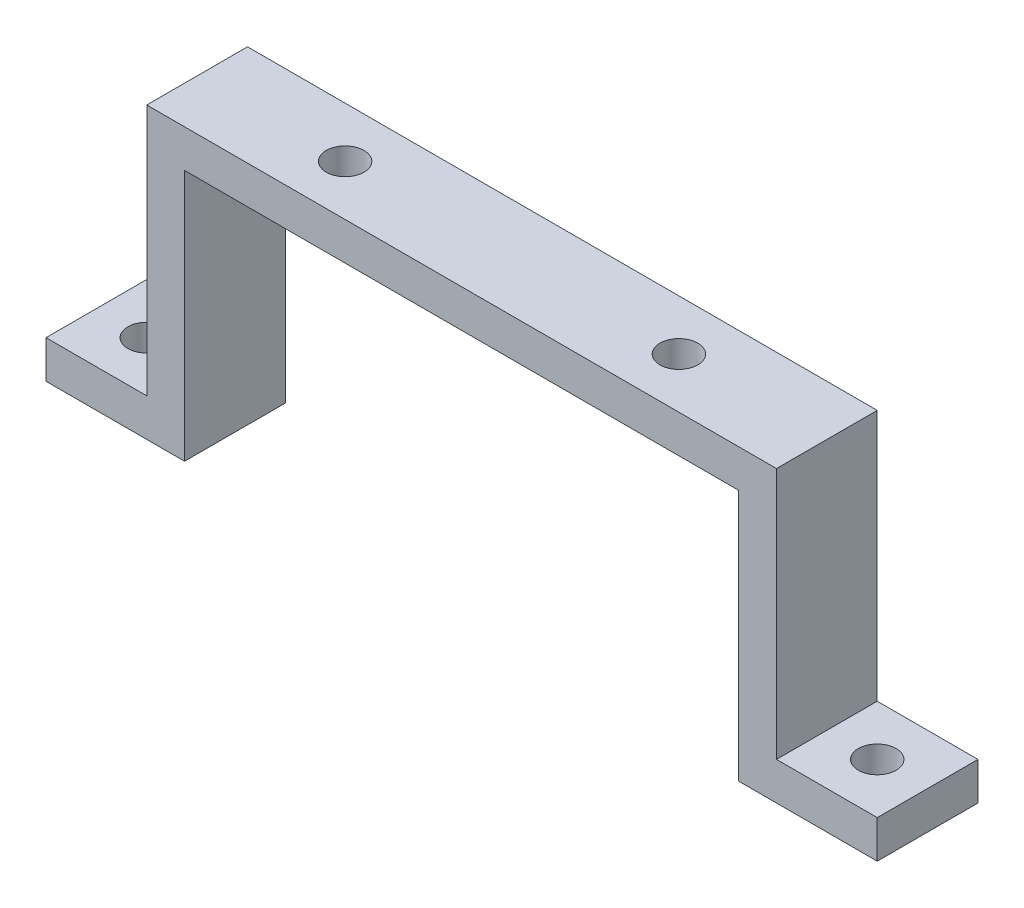
ISO-10303-21;
HEADER;
FILE_DESCRIPTION(('STEP AP214'),'2;1');
FILE_NAME('part.step','',(''),(''),'','','');
FILE_SCHEMA(('AUTOMOTIVE_DESIGN { 1 0 10303 214 1 1 1 1 }'));
ENDSEC;
DATA;
#1=APPLICATION_CONTEXT('core data for automotive mechanical design processes');
#2=APPLICATION_PROTOCOL_DEFINITION('international standard','automotive_design',2000,#1);
#3=PRODUCT_CONTEXT('',#1,'mechanical');
#4=PRODUCT('Part','Part','',(#3));
#5=PRODUCT_RELATED_PRODUCT_CATEGORY('part','',(#4));
#6=PRODUCT_DEFINITION_FORMATION('','',#4);
#7=PRODUCT_DEFINITION_CONTEXT('part definition',#1,'design');
#8=PRODUCT_DEFINITION('design','',#6,#7);
#9=PRODUCT_DEFINITION_SHAPE('','',#8);
#10=(LENGTH_UNIT() NAMED_UNIT(*) SI_UNIT(.MILLI.,.METRE.));
#11=(NAMED_UNIT(*) PLANE_ANGLE_UNIT() SI_UNIT($,.RADIAN.));
#12=(NAMED_UNIT(*) SI_UNIT($,.STERADIAN.) SOLID_ANGLE_UNIT());
#13=UNCERTAINTY_MEASURE_WITH_UNIT(LENGTH_MEASURE(1.E-05),#10,'distance_accuracy_value','');
#14=(GEOMETRIC_REPRESENTATION_CONTEXT(3) GLOBAL_UNCERTAINTY_ASSIGNED_CONTEXT((#13)) GLOBAL_UNIT_ASSIGNED_CONTEXT((#10,
#11,#12)) REPRESENTATION_CONTEXT('',''));
#15=CARTESIAN_POINT('',(0.,0.,0.));
#16=DIRECTION('',(0.,0.,1.));
#17=DIRECTION('',(1.,0.,0.));
#18=AXIS2_PLACEMENT_3D('',#15,#16,#17);
#19=CARTESIAN_POINT('',(25.,3.,4.));
#20=DIRECTION('',(-1.,0.,0.));
#21=DIRECTION('',(0.,0.,1.));
#22=AXIS2_PLACEMENT_3D('',#19,#20,#21);
#23=PLANE('',#22);
#24=DIRECTION('',(0.,0.,1.));
#25=VECTOR('',#24,1.);
#26=CARTESIAN_POINT('',(25.,-17.,-4.));
#27=LINE('',#26,#25);
#28=CARTESIAN_POINT('',(25.,-17.,-4.));
#29=VERTEX_POINT('',#28);
#30=CARTESIAN_POINT('',(25.,-17.,4.));
#31=VERTEX_POINT('',#30);
#32=EDGE_CURVE('E58',#29,#31,#27,.T.);
#33=ORIENTED_EDGE('',*,*,#32,.F.);
#34=DIRECTION('',(0.,-1.,0.));
#35=VECTOR('',#34,1.);
#36=CARTESIAN_POINT('',(25.,3.,-4.));
#37=LINE('',#36,#35);
#38=CARTESIAN_POINT('',(25.,3.,-4.));
#39=VERTEX_POINT('',#38);
#40=EDGE_CURVE('E11',#39,#29,#37,.T.);
#41=ORIENTED_EDGE('',*,*,#40,.F.);
#42=DIRECTION('',(0.,0.,-1.));
#43=VECTOR('',#42,1.);
#44=CARTESIAN_POINT('',(25.,3.,4.));
#45=LINE('',#44,#43);
#46=CARTESIAN_POINT('',(25.,3.,4.));
#47=VERTEX_POINT('',#46);
#48=EDGE_CURVE('E262',#47,#39,#45,.T.);
#49=ORIENTED_EDGE('',*,*,#48,.F.);
#50=DIRECTION('',(0.,-1.,0.));
#51=VECTOR('',#50,1.);
#52=CARTESIAN_POINT('',(25.,3.,4.));
#53=LINE('',#52,#51);
#54=EDGE_CURVE('E276',#47,#31,#53,.T.);
#55=ORIENTED_EDGE('',*,*,#54,.T.);
#56=EDGE_LOOP('',(#33,#41,#49,#55));
#57=FACE_BOUND('',#56,.T.);
#58=ADVANCED_FACE('F43',(#57),#23,.F.);
#59=CARTESIAN_POINT('',(0.,3.,0.));
#60=DIRECTION('',(0.,-1.,0.));
#61=DIRECTION('',(0.,0.,-1.));
#62=AXIS2_PLACEMENT_3D('',#59,#60,#61);
#63=PLANE('',#62);
#64=ORIENTED_EDGE('',*,*,#48,.T.);
#65=DIRECTION('',(-1.,0.,0.));
#66=VECTOR('',#65,1.);
#67=CARTESIAN_POINT('',(-25.,3.,-4.));
#68=LINE('',#67,#66);
#69=CARTESIAN_POINT('',(-25.,3.,-4.));
#70=VERTEX_POINT('',#69);
#71=EDGE_CURVE('E266',#39,#70,#68,.T.);
#72=ORIENTED_EDGE('',*,*,#71,.T.);
#73=DIRECTION('',(0.,0.,1.));
#74=VECTOR('',#73,1.);
#75=CARTESIAN_POINT('',(-25.,3.,4.));
#76=LINE('',#75,#74);
#77=CARTESIAN_POINT('',(-25.,3.,4.));
#78=VERTEX_POINT('',#77);
#79=EDGE_CURVE('E270',#70,#78,#76,.T.);
#80=ORIENTED_EDGE('',*,*,#79,.T.);
#81=DIRECTION('',(1.,0.,0.));
#82=VECTOR('',#81,1.);
#83=CARTESIAN_POINT('',(-25.,3.,4.));
#84=LINE('',#83,#82);
#85=EDGE_CURVE('E273',#78,#47,#84,.T.);
#86=ORIENTED_EDGE('',*,*,#85,.T.);
#87=EDGE_LOOP('',(#64,#72,#80,#86));
#88=FACE_BOUND('',#87,.T.);
#89=CARTESIAN_POINT('',(-13.25,3.,0.));
#90=DIRECTION('',(0.,1.,0.));
#91=DIRECTION('',(0.,0.,1.));
#92=AXIS2_PLACEMENT_3D('',#89,#90,#91);
#93=CIRCLE('',#92,1.5);
#94=CARTESIAN_POINT('',(-13.25,3.,1.5));
#95=VERTEX_POINT('',#94);
#96=EDGE_CURVE('E254',#95,#95,#93,.T.);
#97=ORIENTED_EDGE('',*,*,#96,.F.);
#98=EDGE_LOOP('',(#97));
#99=FACE_BOUND('',#98,.T.);
#100=CARTESIAN_POINT('',(13.25,3.,0.));
#101=DIRECTION('',(0.,1.,0.));
#102=DIRECTION('',(0.,0.,1.));
#103=AXIS2_PLACEMENT_3D('',#100,#101,#102);
#104=CIRCLE('',#103,1.5);
#105=CARTESIAN_POINT('',(13.25,3.,1.5));
#106=VERTEX_POINT('',#105);
#107=EDGE_CURVE('E246',#106,#106,#104,.T.);
#108=ORIENTED_EDGE('',*,*,#107,.F.);
#109=EDGE_LOOP('',(#108));
#110=FACE_BOUND('',#109,.T.);
#111=ADVANCED_FACE('F305',(#88,#99,#110),#63,.F.);
#112=CARTESIAN_POINT('',(0.,0.,0.));
#113=DIRECTION('',(0.,-1.,0.));
#114=DIRECTION('',(0.,0.,-1.));
#115=AXIS2_PLACEMENT_3D('',#112,#113,#114);
#116=PLANE('',#115);
#117=DIRECTION('',(0.,0.,1.));
#118=VECTOR('',#117,1.);
#119=CARTESIAN_POINT('',(22.,0.,-4.));
#120=LINE('',#119,#118);
#121=CARTESIAN_POINT('',(22.,0.,-4.));
#122=VERTEX_POINT('',#121);
#123=CARTESIAN_POINT('',(22.,0.,4.));
#124=VERTEX_POINT('',#123);
#125=EDGE_CURVE('E170',#122,#124,#120,.T.);
#126=ORIENTED_EDGE('',*,*,#125,.T.);
#127=DIRECTION('',(1.,0.,0.));
#128=VECTOR('',#127,1.);
#129=CARTESIAN_POINT('',(-25.,0.,4.));
#130=LINE('',#129,#128);
#131=CARTESIAN_POINT('',(-22.,0.,4.));
#132=VERTEX_POINT('',#131);
#133=EDGE_CURVE('E267',#132,#124,#130,.T.);
#134=ORIENTED_EDGE('',*,*,#133,.F.);
#135=DIRECTION('',(0.,0.,1.));
#136=VECTOR('',#135,1.);
#137=CARTESIAN_POINT('',(-22.,0.,-4.));
#138=LINE('',#137,#136);
#139=CARTESIAN_POINT('',(-22.,0.,-4.));
#140=VERTEX_POINT('',#139);
#141=EDGE_CURVE('E221',#140,#132,#138,.T.);
#142=ORIENTED_EDGE('',*,*,#141,.F.);
#143=DIRECTION('',(-1.,0.,0.));
#144=VECTOR('',#143,1.);
#145=CARTESIAN_POINT('',(-25.,0.,-4.));
#146=LINE('',#145,#144);
#147=EDGE_CURVE('E258',#122,#140,#146,.T.);
#148=ORIENTED_EDGE('',*,*,#147,.F.);
#149=EDGE_LOOP('',(#126,#134,#142,#148));
#150=FACE_BOUND('',#149,.T.);
#151=CARTESIAN_POINT('',(-13.25,0.,0.));
#152=DIRECTION('',(0.,1.,0.));
#153=DIRECTION('',(0.,0.,1.));
#154=AXIS2_PLACEMENT_3D('',#151,#152,#153);
#155=CIRCLE('',#154,1.5);
#156=CARTESIAN_POINT('',(-13.25,0.,1.5));
#157=VERTEX_POINT('',#156);
#158=EDGE_CURVE('E250',#157,#157,#155,.T.);
#159=ORIENTED_EDGE('',*,*,#158,.T.);
#160=EDGE_LOOP('',(#159));
#161=FACE_BOUND('',#160,.T.);
#162=CARTESIAN_POINT('',(13.25,0.,0.));
#163=DIRECTION('',(0.,1.,0.));
#164=DIRECTION('',(0.,0.,1.));
#165=AXIS2_PLACEMENT_3D('',#162,#163,#164);
#166=CIRCLE('',#165,1.5);
#167=CARTESIAN_POINT('',(13.25,0.,1.5));
#168=VERTEX_POINT('',#167);
#169=EDGE_CURVE('E245',#168,#168,#166,.T.);
#170=ORIENTED_EDGE('',*,*,#169,.T.);
#171=EDGE_LOOP('',(#170));
#172=FACE_BOUND('',#171,.T.);
#173=ADVANCED_FACE('F311',(#150,#161,#172),#116,.T.);
#174=CARTESIAN_POINT('',(-25.,3.,-4.));
#175=DIRECTION('',(0.,0.,1.));
#176=DIRECTION('',(1.,0.,0.));
#177=AXIS2_PLACEMENT_3D('',#174,#175,#176);
#178=PLANE('',#177);
#179=ORIENTED_EDGE('',*,*,#40,.T.);
#180=DIRECTION('',(-1.,0.,0.));
#181=VECTOR('',#180,1.);
#182=CARTESIAN_POINT('',(25.,-17.,-4.));
#183=LINE('',#182,#181);
#184=CARTESIAN_POINT('',(33.,-17.,-4.));
#185=VERTEX_POINT('',#184);
#186=EDGE_CURVE('E138',#185,#29,#183,.T.);
#187=ORIENTED_EDGE('',*,*,#186,.F.);
#188=DIRECTION('',(0.,-1.,0.));
#189=VECTOR('',#188,1.);
#190=CARTESIAN_POINT('',(33.,-17.,-4.));
#191=LINE('',#190,#189);
#192=CARTESIAN_POINT('',(33.,-20.,-4.));
#193=VERTEX_POINT('',#192);
#194=EDGE_CURVE('E148',#185,#193,#191,.T.);
#195=ORIENTED_EDGE('',*,*,#194,.T.);
#196=DIRECTION('',(-1.,0.,0.));
#197=VECTOR('',#196,1.);
#198=CARTESIAN_POINT('',(25.,-20.,-4.));
#199=LINE('',#198,#197);
#200=CARTESIAN_POINT('',(22.,-20.,-4.));
#201=VERTEX_POINT('',#200);
#202=EDGE_CURVE('E179',#193,#201,#199,.T.);
#203=ORIENTED_EDGE('',*,*,#202,.T.);
#204=DIRECTION('',(0.,1.,0.));
#205=VECTOR('',#204,1.);
#206=CARTESIAN_POINT('',(22.,-20.,-4.));
#207=LINE('',#206,#205);
#208=EDGE_CURVE('E182',#201,#122,#207,.T.);
#209=ORIENTED_EDGE('',*,*,#208,.T.);
#210=ORIENTED_EDGE('',*,*,#147,.T.);
#211=DIRECTION('',(0.,1.,0.));
#212=VECTOR('',#211,1.);
#213=CARTESIAN_POINT('',(-22.,-20.,-4.));
#214=LINE('',#213,#212);
#215=CARTESIAN_POINT('',(-22.,-20.,-4.));
#216=VERTEX_POINT('',#215);
#217=EDGE_CURVE('E241',#216,#140,#214,.T.);
#218=ORIENTED_EDGE('',*,*,#217,.F.);
#219=DIRECTION('',(1.,0.,0.));
#220=VECTOR('',#219,1.);
#221=CARTESIAN_POINT('',(-25.,-20.,-4.));
#222=LINE('',#221,#220);
#223=CARTESIAN_POINT('',(-33.,-20.,-4.));
#224=VERTEX_POINT('',#223);
#225=EDGE_CURVE('E225',#224,#216,#222,.T.);
#226=ORIENTED_EDGE('',*,*,#225,.F.);
#227=DIRECTION('',(0.,-1.,0.));
#228=VECTOR('',#227,1.);
#229=CARTESIAN_POINT('',(-33.,-17.,-4.));
#230=LINE('',#229,#228);
#231=CARTESIAN_POINT('',(-33.,-17.,-4.));
#232=VERTEX_POINT('',#231);
#233=EDGE_CURVE('E217',#232,#224,#230,.T.);
#234=ORIENTED_EDGE('',*,*,#233,.F.);
#235=DIRECTION('',(1.,0.,0.));
#236=VECTOR('',#235,1.);
#237=CARTESIAN_POINT('',(-25.,-17.,-4.));
#238=LINE('',#237,#236);
#239=CARTESIAN_POINT('',(-25.,-17.,-4.));
#240=VERTEX_POINT('',#239);
#241=EDGE_CURVE('E209',#232,#240,#238,.T.);
#242=ORIENTED_EDGE('',*,*,#241,.T.);
#243=DIRECTION('',(0.,-1.,0.));
#244=VECTOR('',#243,1.);
#245=CARTESIAN_POINT('',(-25.,3.,-4.));
#246=LINE('',#245,#244);
#247=EDGE_CURVE('E51',#70,#240,#246,.T.);
#248=ORIENTED_EDGE('',*,*,#247,.F.);
#249=ORIENTED_EDGE('',*,*,#71,.F.);
#250=EDGE_LOOP('',(#179,#187,#195,#203,#209,#210,#218,#226,#234,#242,#248,#249));
#251=FACE_BOUND('',#250,.T.);
#252=ADVANCED_FACE('F157',(#251),#178,.F.);
#253=CARTESIAN_POINT('',(-25.,3.,4.));
#254=DIRECTION('',(1.,0.,0.));
#255=DIRECTION('',(0.,0.,-1.));
#256=AXIS2_PLACEMENT_3D('',#253,#254,#255);
#257=PLANE('',#256);
#258=ORIENTED_EDGE('',*,*,#247,.T.);
#259=DIRECTION('',(0.,0.,1.));
#260=VECTOR('',#259,1.);
#261=CARTESIAN_POINT('',(-25.,-17.,-4.));
#262=LINE('',#261,#260);
#263=CARTESIAN_POINT('',(-25.,-17.,4.));
#264=VERTEX_POINT('',#263);
#265=EDGE_CURVE('E200',#240,#264,#262,.T.);
#266=ORIENTED_EDGE('',*,*,#265,.T.);
#267=DIRECTION('',(0.,-1.,0.));
#268=VECTOR('',#267,1.);
#269=CARTESIAN_POINT('',(-25.,3.,4.));
#270=LINE('',#269,#268);
#271=EDGE_CURVE('E284',#78,#264,#270,.T.);
#272=ORIENTED_EDGE('',*,*,#271,.F.);
#273=ORIENTED_EDGE('',*,*,#79,.F.);
#274=EDGE_LOOP('',(#258,#266,#272,#273));
#275=FACE_BOUND('',#274,.T.);
#276=ADVANCED_FACE('F292',(#275),#257,.F.);
#277=CARTESIAN_POINT('',(-25.,3.,4.));
#278=DIRECTION('',(0.,0.,-1.));
#279=DIRECTION('',(-1.,0.,0.));
#280=AXIS2_PLACEMENT_3D('',#277,#278,#279);
#281=PLANE('',#280);
#282=ORIENTED_EDGE('',*,*,#271,.T.);
#283=DIRECTION('',(-1.,0.,0.));
#284=VECTOR('',#283,1.);
#285=CARTESIAN_POINT('',(-25.,-17.,4.));
#286=LINE('',#285,#284);
#287=CARTESIAN_POINT('',(-33.,-17.,4.));
#288=VERTEX_POINT('',#287);
#289=EDGE_CURVE('E65',#264,#288,#286,.T.);
#290=ORIENTED_EDGE('',*,*,#289,.T.);
#291=DIRECTION('',(0.,-1.,0.));
#292=VECTOR('',#291,1.);
#293=CARTESIAN_POINT('',(-33.,-17.,4.));
#294=LINE('',#293,#292);
#295=CARTESIAN_POINT('',(-33.,-20.,4.));
#296=VERTEX_POINT('',#295);
#297=EDGE_CURVE('E213',#288,#296,#294,.T.);
#298=ORIENTED_EDGE('',*,*,#297,.T.);
#299=DIRECTION('',(-1.,0.,0.));
#300=VECTOR('',#299,1.);
#301=CARTESIAN_POINT('',(-25.,-20.,4.));
#302=LINE('',#301,#300);
#303=CARTESIAN_POINT('',(-22.,-20.,4.));
#304=VERTEX_POINT('',#303);
#305=EDGE_CURVE('E231',#304,#296,#302,.T.);
#306=ORIENTED_EDGE('',*,*,#305,.F.);
#307=DIRECTION('',(0.,1.,0.));
#308=VECTOR('',#307,1.);
#309=CARTESIAN_POINT('',(-22.,-20.,4.));
#310=LINE('',#309,#308);
#311=EDGE_CURVE('E234',#304,#132,#310,.T.);
#312=ORIENTED_EDGE('',*,*,#311,.T.);
#313=ORIENTED_EDGE('',*,*,#133,.T.);
#314=DIRECTION('',(0.,1.,0.));
#315=VECTOR('',#314,1.);
#316=CARTESIAN_POINT('',(22.,-20.,4.));
#317=LINE('',#316,#315);
#318=CARTESIAN_POINT('',(22.,-20.,4.));
#319=VERTEX_POINT('',#318);
#320=EDGE_CURVE('E188',#319,#124,#317,.T.);
#321=ORIENTED_EDGE('',*,*,#320,.F.);
#322=DIRECTION('',(1.,0.,0.));
#323=VECTOR('',#322,1.);
#324=CARTESIAN_POINT('',(25.,-20.,4.));
#325=LINE('',#324,#323);
#326=CARTESIAN_POINT('',(33.,-20.,4.));
#327=VERTEX_POINT('',#326);
#328=EDGE_CURVE('E172',#319,#327,#325,.T.);
#329=ORIENTED_EDGE('',*,*,#328,.T.);
#330=DIRECTION('',(0.,-1.,0.));
#331=VECTOR('',#330,1.);
#332=CARTESIAN_POINT('',(33.,-17.,4.));
#333=LINE('',#332,#331);
#334=CARTESIAN_POINT('',(33.,-17.,4.));
#335=VERTEX_POINT('',#334);
#336=EDGE_CURVE('E155',#335,#327,#333,.T.);
#337=ORIENTED_EDGE('',*,*,#336,.F.);
#338=DIRECTION('',(1.,0.,0.));
#339=VECTOR('',#338,1.);
#340=CARTESIAN_POINT('',(25.,-17.,4.));
#341=LINE('',#340,#339);
#342=EDGE_CURVE('E140',#31,#335,#341,.T.);
#343=ORIENTED_EDGE('',*,*,#342,.F.);
#344=ORIENTED_EDGE('',*,*,#54,.F.);
#345=ORIENTED_EDGE('',*,*,#85,.F.);
#346=EDGE_LOOP('',(#282,#290,#298,#306,#312,#313,#321,#329,#337,#343,#344,#345));
#347=FACE_BOUND('',#346,.T.);
#348=ADVANCED_FACE('F298',(#347),#281,.F.);
#349=CARTESIAN_POINT('',(-13.25,3.,0.));
#350=DIRECTION('',(0.,-1.,0.));
#351=DIRECTION('',(0.,0.,-1.));
#352=AXIS2_PLACEMENT_3D('',#349,#350,#351);
#353=CYLINDRICAL_SURFACE('',#352,1.5);
#354=ORIENTED_EDGE('',*,*,#96,.T.);
#355=EDGE_LOOP('',(#354));
#356=FACE_BOUND('',#355,.T.);
#357=ORIENTED_EDGE('',*,*,#158,.F.);
#358=EDGE_LOOP('',(#357));
#359=FACE_BOUND('',#358,.T.);
#360=ADVANCED_FACE('F319',(#356,#359),#353,.F.);
#361=CARTESIAN_POINT('',(13.25,3.,0.));
#362=DIRECTION('',(0.,-1.,0.));
#363=DIRECTION('',(0.,0.,-1.));
#364=AXIS2_PLACEMENT_3D('',#361,#362,#363);
#365=CYLINDRICAL_SURFACE('',#364,1.5);
#366=ORIENTED_EDGE('',*,*,#107,.T.);
#367=EDGE_LOOP('',(#366));
#368=FACE_BOUND('',#367,.T.);
#369=ORIENTED_EDGE('',*,*,#169,.F.);
#370=EDGE_LOOP('',(#369));
#371=FACE_BOUND('',#370,.T.);
#372=ADVANCED_FACE('F347',(#368,#371),#365,.F.);
#373=CARTESIAN_POINT('',(-22.,-20.,-4.));
#374=DIRECTION('',(-1.,0.,0.));
#375=DIRECTION('',(0.,0.,1.));
#376=AXIS2_PLACEMENT_3D('',#373,#374,#375);
#377=PLANE('',#376);
#378=ORIENTED_EDGE('',*,*,#141,.T.);
#379=ORIENTED_EDGE('',*,*,#311,.F.);
#380=DIRECTION('',(0.,0.,1.));
#381=VECTOR('',#380,1.);
#382=CARTESIAN_POINT('',(-22.,-20.,-4.));
#383=LINE('',#382,#381);
#384=EDGE_CURVE('E228',#216,#304,#383,.T.);
#385=ORIENTED_EDGE('',*,*,#384,.F.);
#386=ORIENTED_EDGE('',*,*,#217,.T.);
#387=EDGE_LOOP('',(#378,#379,#385,#386));
#388=FACE_BOUND('',#387,.T.);
#389=ADVANCED_FACE('F354',(#388),#377,.F.);
#390=CARTESIAN_POINT('',(0.,-20.,0.));
#391=DIRECTION('',(0.,1.,0.));
#392=DIRECTION('',(0.,0.,1.));
#393=AXIS2_PLACEMENT_3D('',#390,#391,#392);
#394=PLANE('',#393);
#395=ORIENTED_EDGE('',*,*,#305,.T.);
#396=DIRECTION('',(0.,0.,-1.));
#397=VECTOR('',#396,1.);
#398=CARTESIAN_POINT('',(-33.,-20.,-4.));
#399=LINE('',#398,#397);
#400=EDGE_CURVE('E196',#296,#224,#399,.T.);
#401=ORIENTED_EDGE('',*,*,#400,.T.);
#402=ORIENTED_EDGE('',*,*,#225,.T.);
#403=ORIENTED_EDGE('',*,*,#384,.T.);
#404=EDGE_LOOP('',(#395,#401,#402,#403));
#405=FACE_BOUND('',#404,.T.);
#406=CARTESIAN_POINT('',(-29.,-20.,0.));
#407=DIRECTION('',(0.,-1.,0.));
#408=DIRECTION('',(0.,0.,-1.));
#409=AXIS2_PLACEMENT_3D('',#406,#407,#408);
#410=CIRCLE('',#409,1.5);
#411=CARTESIAN_POINT('',(-29.,-20.,-1.5));
#412=VERTEX_POINT('',#411);
#413=EDGE_CURVE('E191',#412,#412,#410,.T.);
#414=ORIENTED_EDGE('',*,*,#413,.F.);
#415=EDGE_LOOP('',(#414));
#416=FACE_BOUND('',#415,.T.);
#417=ADVANCED_FACE('F360',(#405,#416),#394,.F.);
#418=CARTESIAN_POINT('',(-33.,-17.,-4.));
#419=DIRECTION('',(-1.,0.,0.));
#420=DIRECTION('',(0.,0.,1.));
#421=AXIS2_PLACEMENT_3D('',#418,#419,#420);
#422=PLANE('',#421);
#423=ORIENTED_EDGE('',*,*,#400,.F.);
#424=ORIENTED_EDGE('',*,*,#297,.F.);
#425=DIRECTION('',(0.,0.,-1.));
#426=VECTOR('',#425,1.);
#427=CARTESIAN_POINT('',(-33.,-17.,-4.));
#428=LINE('',#427,#426);
#429=EDGE_CURVE('E205',#288,#232,#428,.T.);
#430=ORIENTED_EDGE('',*,*,#429,.T.);
#431=ORIENTED_EDGE('',*,*,#233,.T.);
#432=EDGE_LOOP('',(#423,#424,#430,#431));
#433=FACE_BOUND('',#432,.T.);
#434=ADVANCED_FACE('F367',(#433),#422,.T.);
#435=CARTESIAN_POINT('',(0.,-17.,0.));
#436=DIRECTION('',(0.,-1.,0.));
#437=DIRECTION('',(0.,0.,-1.));
#438=AXIS2_PLACEMENT_3D('',#435,#436,#437);
#439=PLANE('',#438);
#440=CARTESIAN_POINT('',(-29.,-17.,0.));
#441=DIRECTION('',(0.,-1.,0.));
#442=DIRECTION('',(0.,0.,-1.));
#443=AXIS2_PLACEMENT_3D('',#440,#441,#442);
#444=CIRCLE('',#443,1.5);
#445=CARTESIAN_POINT('',(-29.,-17.,-1.5));
#446=VERTEX_POINT('',#445);
#447=EDGE_CURVE('E192',#446,#446,#444,.T.);
#448=ORIENTED_EDGE('',*,*,#447,.T.);
#449=EDGE_LOOP('',(#448));
#450=FACE_BOUND('',#449,.T.);
#451=ORIENTED_EDGE('',*,*,#265,.F.);
#452=ORIENTED_EDGE('',*,*,#241,.F.);
#453=ORIENTED_EDGE('',*,*,#429,.F.);
#454=ORIENTED_EDGE('',*,*,#289,.F.);
#455=EDGE_LOOP('',(#451,#452,#453,#454));
#456=FACE_BOUND('',#455,.T.);
#457=ADVANCED_FACE('F295',(#450,#456),#439,.F.);
#458=CARTESIAN_POINT('',(-29.,-17.,0.));
#459=DIRECTION('',(0.,-1.,0.));
#460=DIRECTION('',(0.,0.,-1.));
#461=AXIS2_PLACEMENT_3D('',#458,#459,#460);
#462=CYLINDRICAL_SURFACE('',#461,1.5);
#463=ORIENTED_EDGE('',*,*,#447,.F.);
#464=EDGE_LOOP('',(#463));
#465=FACE_BOUND('',#464,.T.);
#466=ORIENTED_EDGE('',*,*,#413,.T.);
#467=EDGE_LOOP('',(#466));
#468=FACE_BOUND('',#467,.T.);
#469=ADVANCED_FACE('F381',(#465,#468),#462,.F.);
#470=CARTESIAN_POINT('',(22.,-20.,-4.));
#471=DIRECTION('',(-1.,0.,0.));
#472=DIRECTION('',(0.,0.,1.));
#473=AXIS2_PLACEMENT_3D('',#470,#471,#472);
#474=PLANE('',#473);
#475=ORIENTED_EDGE('',*,*,#125,.F.);
#476=ORIENTED_EDGE('',*,*,#208,.F.);
#477=DIRECTION('',(0.,0.,1.));
#478=VECTOR('',#477,1.);
#479=CARTESIAN_POINT('',(22.,-20.,-4.));
#480=LINE('',#479,#478);
#481=EDGE_CURVE('E175',#201,#319,#480,.T.);
#482=ORIENTED_EDGE('',*,*,#481,.T.);
#483=ORIENTED_EDGE('',*,*,#320,.T.);
#484=EDGE_LOOP('',(#475,#476,#482,#483));
#485=FACE_BOUND('',#484,.T.);
#486=ADVANCED_FACE('F389',(#485),#474,.T.);
#487=CARTESIAN_POINT('',(0.,-20.,0.));
#488=DIRECTION('',(0.,1.,0.));
#489=DIRECTION('',(0.,0.,1.));
#490=AXIS2_PLACEMENT_3D('',#487,#488,#489);
#491=PLANE('',#490);
#492=ORIENTED_EDGE('',*,*,#202,.F.);
#493=DIRECTION('',(0.,0.,-1.));
#494=VECTOR('',#493,1.);
#495=CARTESIAN_POINT('',(33.,-20.,-4.));
#496=LINE('',#495,#494);
#497=EDGE_CURVE('E151',#327,#193,#496,.T.);
#498=ORIENTED_EDGE('',*,*,#497,.F.);
#499=ORIENTED_EDGE('',*,*,#328,.F.);
#500=ORIENTED_EDGE('',*,*,#481,.F.);
#501=EDGE_LOOP('',(#492,#498,#499,#500));
#502=FACE_BOUND('',#501,.T.);
#503=CARTESIAN_POINT('',(29.,-20.,0.));
#504=DIRECTION('',(0.,1.,0.));
#505=DIRECTION('',(0.,0.,-1.));
#506=AXIS2_PLACEMENT_3D('',#503,#504,#505);
#507=CIRCLE('',#506,1.5);
#508=CARTESIAN_POINT('',(29.,-20.,-1.5));
#509=VERTEX_POINT('',#508);
#510=EDGE_CURVE('E546',#509,#509,#507,.T.);
#511=ORIENTED_EDGE('',*,*,#510,.T.);
#512=EDGE_LOOP('',(#511));
#513=FACE_BOUND('',#512,.T.);
#514=ADVANCED_FACE('F396',(#502,#513),#491,.F.);
#515=CARTESIAN_POINT('',(0.,-17.,0.));
#516=DIRECTION('',(0.,-1.,0.));
#517=DIRECTION('',(0.,0.,-1.));
#518=AXIS2_PLACEMENT_3D('',#515,#516,#517);
#519=PLANE('',#518);
#520=ORIENTED_EDGE('',*,*,#32,.T.);
#521=ORIENTED_EDGE('',*,*,#342,.T.);
#522=DIRECTION('',(0.,0.,-1.));
#523=VECTOR('',#522,1.);
#524=CARTESIAN_POINT('',(33.,-17.,-4.));
#525=LINE('',#524,#523);
#526=EDGE_CURVE('E133',#335,#185,#525,.T.);
#527=ORIENTED_EDGE('',*,*,#526,.T.);
#528=ORIENTED_EDGE('',*,*,#186,.T.);
#529=EDGE_LOOP('',(#520,#521,#527,#528));
#530=FACE_BOUND('',#529,.T.);
#531=CARTESIAN_POINT('',(29.,-17.,0.));
#532=DIRECTION('',(0.,1.,0.));
#533=DIRECTION('',(0.,0.,-1.));
#534=AXIS2_PLACEMENT_3D('',#531,#532,#533);
#535=CIRCLE('',#534,1.5);
#536=CARTESIAN_POINT('',(29.,-17.,-1.5));
#537=VERTEX_POINT('',#536);
#538=EDGE_CURVE('E168',#537,#537,#535,.T.);
#539=ORIENTED_EDGE('',*,*,#538,.F.);
#540=EDGE_LOOP('',(#539));
#541=FACE_BOUND('',#540,.T.);
#542=ADVANCED_FACE('F135',(#530,#541),#519,.F.);
#543=CARTESIAN_POINT('',(33.,-17.,-4.));
#544=DIRECTION('',(-1.,0.,0.));
#545=DIRECTION('',(0.,0.,1.));
#546=AXIS2_PLACEMENT_3D('',#543,#544,#545);
#547=PLANE('',#546);
#548=ORIENTED_EDGE('',*,*,#497,.T.);
#549=ORIENTED_EDGE('',*,*,#194,.F.);
#550=ORIENTED_EDGE('',*,*,#526,.F.);
#551=ORIENTED_EDGE('',*,*,#336,.T.);
#552=EDGE_LOOP('',(#548,#549,#550,#551));
#553=FACE_BOUND('',#552,.T.);
#554=ADVANCED_FACE('F149',(#553),#547,.F.);
#555=CARTESIAN_POINT('',(29.,-17.,0.));
#556=DIRECTION('',(0.,-1.,0.));
#557=DIRECTION('',(0.,0.,-1.));
#558=AXIS2_PLACEMENT_3D('',#555,#556,#557);
#559=CYLINDRICAL_SURFACE('',#558,1.5);
#560=ORIENTED_EDGE('',*,*,#538,.T.);
#561=EDGE_LOOP('',(#560));
#562=FACE_BOUND('',#561,.T.);
#563=ORIENTED_EDGE('',*,*,#510,.F.);
#564=EDGE_LOOP('',(#563));
#565=FACE_BOUND('',#564,.T.);
#566=ADVANCED_FACE('F417',(#562,#565),#559,.F.);
#567=CLOSED_SHELL('',(#58,#111,#173,#252,#276,#348,#360,#372,#389,#417,#434,#457,#469,#486,#514,
#542,#554,#566));
#568=MANIFOLD_SOLID_BREP('B2',#567);
#569=ADVANCED_BREP_SHAPE_REPRESENTATION('',(#18,#568),#14);
#570=SHAPE_DEFINITION_REPRESENTATION(#9,#569);
ENDSEC;
END-ISO-10303-21;
